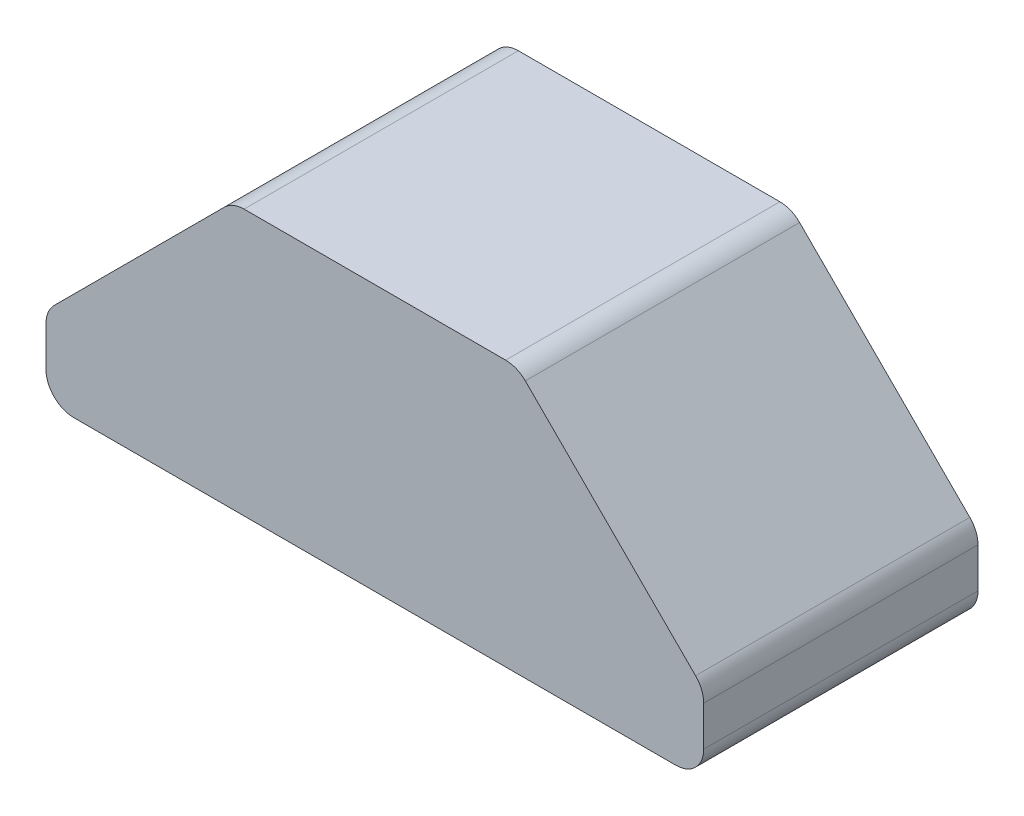
ISO-10303-21;
HEADER;
FILE_DESCRIPTION(('STEP AP214'),'2;1');
FILE_NAME('part.step','',(''),(''),'','','');
FILE_SCHEMA(('AUTOMOTIVE_DESIGN { 1 0 10303 214 1 1 1 1 }'));
ENDSEC;
DATA;
#1=APPLICATION_CONTEXT('core data for automotive mechanical design processes');
#2=APPLICATION_PROTOCOL_DEFINITION('international standard','automotive_design',2000,#1);
#3=PRODUCT_CONTEXT('',#1,'mechanical');
#4=PRODUCT('Part','Part','',(#3));
#5=PRODUCT_RELATED_PRODUCT_CATEGORY('part','',(#4));
#6=PRODUCT_DEFINITION_FORMATION('','',#4);
#7=PRODUCT_DEFINITION_CONTEXT('part definition',#1,'design');
#8=PRODUCT_DEFINITION('design','',#6,#7);
#9=PRODUCT_DEFINITION_SHAPE('','',#8);
#10=(LENGTH_UNIT() NAMED_UNIT(*) SI_UNIT(.MILLI.,.METRE.));
#11=(NAMED_UNIT(*) PLANE_ANGLE_UNIT() SI_UNIT($,.RADIAN.));
#12=(NAMED_UNIT(*) SI_UNIT($,.STERADIAN.) SOLID_ANGLE_UNIT());
#13=UNCERTAINTY_MEASURE_WITH_UNIT(LENGTH_MEASURE(1.E-05),#10,'distance_accuracy_value','');
#14=(GEOMETRIC_REPRESENTATION_CONTEXT(3) GLOBAL_UNCERTAINTY_ASSIGNED_CONTEXT((#13)) GLOBAL_UNIT_ASSIGNED_CONTEXT((#10,
#11,#12)) REPRESENTATION_CONTEXT('',''));
#15=CARTESIAN_POINT('',(0.,0.,0.));
#16=DIRECTION('',(0.,0.,1.));
#17=DIRECTION('',(1.,0.,0.));
#18=AXIS2_PLACEMENT_3D('',#15,#16,#17);
#19=CARTESIAN_POINT('',(9.03728779759871,-10.9630597708542,-5.));
#20=DIRECTION('',(0.,0.,1.));
#21=DIRECTION('',(1.,0.,0.));
#22=AXIS2_PLACEMENT_3D('',#19,#20,#21);
#23=CYLINDRICAL_SURFACE('',#22,0.508);
#24=CARTESIAN_POINT('',(9.03728779759871,-10.9630597708542,0.));
#25=DIRECTION('',(0.,0.,1.));
#26=DIRECTION('',(1.,0.,0.));
#27=AXIS2_PLACEMENT_3D('',#24,#25,#26);
#28=CIRCLE('',#27,0.508);
#29=CARTESIAN_POINT('',(8.52928779759871,-10.9630597708542,0.));
#30=VERTEX_POINT('',#29);
#31=CARTESIAN_POINT('',(9.03728779759871,-11.4710597708542,0.));
#32=VERTEX_POINT('',#31);
#33=EDGE_CURVE('E179',#30,#32,#28,.T.);
#34=ORIENTED_EDGE('',*,*,#33,.F.);
#35=DIRECTION('',(0.,0.,1.));
#36=VECTOR('',#35,1.);
#37=CARTESIAN_POINT('',(8.52928779759871,-10.9630597708542,-5.));
#38=LINE('',#37,#36);
#39=CARTESIAN_POINT('',(8.52928779759871,-10.9630597708542,-5.));
#40=VERTEX_POINT('',#39);
#41=EDGE_CURVE('E42',#40,#30,#38,.T.);
#42=ORIENTED_EDGE('',*,*,#41,.F.);
#43=CARTESIAN_POINT('',(9.03728779759871,-10.9630597708542,-5.));
#44=DIRECTION('',(0.,0.,1.));
#45=DIRECTION('',(1.,0.,0.));
#46=AXIS2_PLACEMENT_3D('',#43,#44,#45);
#47=CIRCLE('',#46,0.508);
#48=CARTESIAN_POINT('',(9.03728779759871,-11.4710597708542,-5.));
#49=VERTEX_POINT('',#48);
#50=EDGE_CURVE('E141',#40,#49,#47,.T.);
#51=ORIENTED_EDGE('',*,*,#50,.T.);
#52=DIRECTION('',(0.,0.,1.));
#53=VECTOR('',#52,1.);
#54=CARTESIAN_POINT('',(9.03728779759871,-11.4710597708542,-5.));
#55=LINE('',#54,#53);
#56=EDGE_CURVE('E11',#49,#32,#55,.T.);
#57=ORIENTED_EDGE('',*,*,#56,.T.);
#58=EDGE_LOOP('',(#34,#42,#51,#57));
#59=FACE_BOUND('',#58,.T.);
#60=ADVANCED_FACE('F32',(#59),#23,.T.);
#61=CARTESIAN_POINT('',(8.52928779759871,-10.9630597708542,-5.));
#62=DIRECTION('',(-1.,0.,0.));
#63=DIRECTION('',(0.,0.,1.));
#64=AXIS2_PLACEMENT_3D('',#61,#62,#63);
#65=PLANE('',#64);
#66=DIRECTION('',(0.,-1.,0.));
#67=VECTOR('',#66,1.);
#68=CARTESIAN_POINT('',(8.52928779759871,-10.9630597708542,0.));
#69=LINE('',#68,#67);
#70=CARTESIAN_POINT('',(8.52928779759871,-10.2371404323196,0.));
#71=VERTEX_POINT('',#70);
#72=EDGE_CURVE('E127',#71,#30,#69,.T.);
#73=ORIENTED_EDGE('',*,*,#72,.F.);
#74=DIRECTION('',(0.,0.,1.));
#75=VECTOR('',#74,1.);
#76=CARTESIAN_POINT('',(8.52928779759871,-10.2371404323196,-5.));
#77=LINE('',#76,#75);
#78=CARTESIAN_POINT('',(8.52928779759871,-10.2371404323196,-5.));
#79=VERTEX_POINT('',#78);
#80=EDGE_CURVE('E122',#79,#71,#77,.T.);
#81=ORIENTED_EDGE('',*,*,#80,.F.);
#82=DIRECTION('',(0.,-1.,0.));
#83=VECTOR('',#82,1.);
#84=CARTESIAN_POINT('',(8.52928779759871,-10.9630597708542,-5.));
#85=LINE('',#84,#83);
#86=EDGE_CURVE('E125',#79,#40,#85,.T.);
#87=ORIENTED_EDGE('',*,*,#86,.T.);
#88=ORIENTED_EDGE('',*,*,#41,.T.);
#89=EDGE_LOOP('',(#73,#81,#87,#88));
#90=FACE_BOUND('',#89,.T.);
#91=ADVANCED_FACE('F124',(#90),#65,.T.);
#92=CARTESIAN_POINT('',(9.03728779759871,-10.2371404323196,-5.));
#93=DIRECTION('',(0.,0.,1.));
#94=DIRECTION('',(1.,0.,0.));
#95=AXIS2_PLACEMENT_3D('',#92,#93,#94);
#96=CYLINDRICAL_SURFACE('',#95,0.508);
#97=CARTESIAN_POINT('',(9.03728779759871,-10.2371404323196,0.));
#98=DIRECTION('',(0.,0.,1.));
#99=DIRECTION('',(1.,0.,0.));
#100=AXIS2_PLACEMENT_3D('',#97,#98,#99);
#101=CIRCLE('',#100,0.508);
#102=CARTESIAN_POINT('',(8.67807755275595,-9.87793018747682,0.));
#103=VERTEX_POINT('',#102);
#104=EDGE_CURVE('E176',#103,#71,#101,.T.);
#105=ORIENTED_EDGE('',*,*,#104,.F.);
#106=DIRECTION('',(0.,0.,1.));
#107=VECTOR('',#106,1.);
#108=CARTESIAN_POINT('',(8.67807755275595,-9.87793018747682,-5.));
#109=LINE('',#108,#107);
#110=CARTESIAN_POINT('',(8.67807755275595,-9.87793018747682,-5.));
#111=VERTEX_POINT('',#110);
#112=EDGE_CURVE('E132',#111,#103,#109,.T.);
#113=ORIENTED_EDGE('',*,*,#112,.F.);
#114=CARTESIAN_POINT('',(9.03728779759871,-10.2371404323196,-5.));
#115=DIRECTION('',(0.,0.,1.));
#116=DIRECTION('',(1.,0.,0.));
#117=AXIS2_PLACEMENT_3D('',#114,#115,#116);
#118=CIRCLE('',#117,0.508);
#119=EDGE_CURVE('E138',#111,#79,#118,.T.);
#120=ORIENTED_EDGE('',*,*,#119,.T.);
#121=ORIENTED_EDGE('',*,*,#80,.T.);
#122=EDGE_LOOP('',(#105,#113,#120,#121));
#123=FACE_BOUND('',#122,.T.);
#124=ADVANCED_FACE('F143',(#123),#96,.T.);
#125=CARTESIAN_POINT('',(8.67807755275595,-9.87793018747682,-5.));
#126=DIRECTION('',(-0.707106781186548,0.707106781186547,0.));
#127=DIRECTION('',(-0.707106781186547,-0.707106781186548,0.));
#128=AXIS2_PLACEMENT_3D('',#125,#126,#127);
#129=PLANE('',#128);
#130=DIRECTION('',(-0.707106781186547,-0.707106781186548,0.));
#131=VECTOR('',#130,1.);
#132=CARTESIAN_POINT('',(8.67807755275595,-9.87793018747682,0.));
#133=LINE('',#132,#131);
#134=CARTESIAN_POINT('',(11.7811582142213,-6.77484952601147,0.));
#135=VERTEX_POINT('',#134);
#136=EDGE_CURVE('E173',#135,#103,#133,.T.);
#137=ORIENTED_EDGE('',*,*,#136,.F.);
#138=DIRECTION('',(0.,0.,1.));
#139=VECTOR('',#138,1.);
#140=CARTESIAN_POINT('',(11.7811582142213,-6.77484952601147,-5.));
#141=LINE('',#140,#139);
#142=CARTESIAN_POINT('',(11.7811582142213,-6.77484952601147,-5.));
#143=VERTEX_POINT('',#142);
#144=EDGE_CURVE('E184',#143,#135,#141,.T.);
#145=ORIENTED_EDGE('',*,*,#144,.F.);
#146=DIRECTION('',(-0.707106781186547,-0.707106781186548,0.));
#147=VECTOR('',#146,1.);
#148=CARTESIAN_POINT('',(8.67807755275595,-9.87793018747682,-5.));
#149=LINE('',#148,#147);
#150=EDGE_CURVE('E144',#143,#111,#149,.T.);
#151=ORIENTED_EDGE('',*,*,#150,.T.);
#152=ORIENTED_EDGE('',*,*,#112,.T.);
#153=EDGE_LOOP('',(#137,#145,#151,#152));
#154=FACE_BOUND('',#153,.T.);
#155=ADVANCED_FACE('F217',(#154),#129,.T.);
#156=CARTESIAN_POINT('',(12.1403684590641,-7.13405977085423,-5.));
#157=DIRECTION('',(0.,0.,1.));
#158=DIRECTION('',(1.,0.,0.));
#159=AXIS2_PLACEMENT_3D('',#156,#157,#158);
#160=CYLINDRICAL_SURFACE('',#159,0.507999999999999);
#161=CARTESIAN_POINT('',(12.1403684590641,-7.13405977085423,0.));
#162=DIRECTION('',(0.,0.,1.));
#163=DIRECTION('',(1.,0.,0.));
#164=AXIS2_PLACEMENT_3D('',#161,#162,#163);
#165=CIRCLE('',#164,0.507999999999999);
#166=CARTESIAN_POINT('',(12.1403684590641,-6.62605977085423,0.));
#167=VERTEX_POINT('',#166);
#168=EDGE_CURVE('E170',#167,#135,#165,.T.);
#169=ORIENTED_EDGE('',*,*,#168,.F.);
#170=DIRECTION('',(0.,0.,1.));
#171=VECTOR('',#170,1.);
#172=CARTESIAN_POINT('',(12.1403684590641,-6.62605977085423,-5.));
#173=LINE('',#172,#171);
#174=CARTESIAN_POINT('',(12.1403684590641,-6.62605977085423,-5.));
#175=VERTEX_POINT('',#174);
#176=EDGE_CURVE('E186',#175,#167,#173,.T.);
#177=ORIENTED_EDGE('',*,*,#176,.F.);
#178=CARTESIAN_POINT('',(12.1403684590641,-7.13405977085423,-5.));
#179=DIRECTION('',(0.,0.,1.));
#180=DIRECTION('',(1.,0.,0.));
#181=AXIS2_PLACEMENT_3D('',#178,#179,#180);
#182=CIRCLE('',#181,0.507999999999999);
#183=EDGE_CURVE('E146',#175,#143,#182,.T.);
#184=ORIENTED_EDGE('',*,*,#183,.T.);
#185=ORIENTED_EDGE('',*,*,#144,.T.);
#186=EDGE_LOOP('',(#169,#177,#184,#185));
#187=FACE_BOUND('',#186,.T.);
#188=ADVANCED_FACE('F220',(#187),#160,.T.);
#189=CARTESIAN_POINT('',(12.1403684590641,-6.62605977085423,-5.));
#190=DIRECTION('',(0.,1.,0.));
#191=DIRECTION('',(-1.,0.,0.));
#192=AXIS2_PLACEMENT_3D('',#189,#190,#191);
#193=PLANE('',#192);
#194=DIRECTION('',(-1.,0.,0.));
#195=VECTOR('',#194,1.);
#196=CARTESIAN_POINT('',(12.1403684590641,-6.62605977085423,0.));
#197=LINE('',#196,#195);
#198=CARTESIAN_POINT('',(16.9082071361334,-6.62605977085423,0.));
#199=VERTEX_POINT('',#198);
#200=EDGE_CURVE('E167',#199,#167,#197,.T.);
#201=ORIENTED_EDGE('',*,*,#200,.F.);
#202=DIRECTION('',(0.,0.,1.));
#203=VECTOR('',#202,1.);
#204=CARTESIAN_POINT('',(16.9082071361334,-6.62605977085423,-5.));
#205=LINE('',#204,#203);
#206=CARTESIAN_POINT('',(16.9082071361334,-6.62605977085423,-5.));
#207=VERTEX_POINT('',#206);
#208=EDGE_CURVE('E188',#207,#199,#205,.T.);
#209=ORIENTED_EDGE('',*,*,#208,.F.);
#210=DIRECTION('',(-1.,0.,0.));
#211=VECTOR('',#210,1.);
#212=CARTESIAN_POINT('',(12.1403684590641,-6.62605977085423,-5.));
#213=LINE('',#212,#211);
#214=EDGE_CURVE('E353',#207,#175,#213,.T.);
#215=ORIENTED_EDGE('',*,*,#214,.T.);
#216=ORIENTED_EDGE('',*,*,#176,.T.);
#217=EDGE_LOOP('',(#201,#209,#215,#216));
#218=FACE_BOUND('',#217,.T.);
#219=ADVANCED_FACE('F224',(#218),#193,.T.);
#220=CARTESIAN_POINT('',(16.9082071361334,-7.13405977085423,-5.));
#221=DIRECTION('',(0.,0.,1.));
#222=DIRECTION('',(1.,0.,0.));
#223=AXIS2_PLACEMENT_3D('',#220,#221,#222);
#224=CYLINDRICAL_SURFACE('',#223,0.508);
#225=CARTESIAN_POINT('',(16.9082071361334,-7.13405977085423,0.));
#226=DIRECTION('',(0.,0.,1.));
#227=DIRECTION('',(1.,0.,0.));
#228=AXIS2_PLACEMENT_3D('',#225,#226,#227);
#229=CIRCLE('',#228,0.508);
#230=CARTESIAN_POINT('',(17.2674173809761,-6.77484952601147,0.));
#231=VERTEX_POINT('',#230);
#232=EDGE_CURVE('E164',#231,#199,#229,.T.);
#233=ORIENTED_EDGE('',*,*,#232,.F.);
#234=DIRECTION('',(0.,0.,1.));
#235=VECTOR('',#234,1.);
#236=CARTESIAN_POINT('',(17.2674173809761,-6.77484952601147,-5.));
#237=LINE('',#236,#235);
#238=CARTESIAN_POINT('',(17.2674173809761,-6.77484952601147,-5.));
#239=VERTEX_POINT('',#238);
#240=EDGE_CURVE('E190',#239,#231,#237,.T.);
#241=ORIENTED_EDGE('',*,*,#240,.F.);
#242=CARTESIAN_POINT('',(16.9082071361334,-7.13405977085423,-5.));
#243=DIRECTION('',(0.,0.,1.));
#244=DIRECTION('',(1.,0.,0.));
#245=AXIS2_PLACEMENT_3D('',#242,#243,#244);
#246=CIRCLE('',#245,0.508);
#247=EDGE_CURVE('E357',#239,#207,#246,.T.);
#248=ORIENTED_EDGE('',*,*,#247,.T.);
#249=ORIENTED_EDGE('',*,*,#208,.T.);
#250=EDGE_LOOP('',(#233,#241,#248,#249));
#251=FACE_BOUND('',#250,.T.);
#252=ADVANCED_FACE('F228',(#251),#224,.T.);
#253=CARTESIAN_POINT('',(17.2674173809761,-6.77484952601147,-5.));
#254=DIRECTION('',(0.707106781186547,0.707106781186548,0.));
#255=DIRECTION('',(-0.707106781186548,0.707106781186547,0.));
#256=AXIS2_PLACEMENT_3D('',#253,#254,#255);
#257=PLANE('',#256);
#258=DIRECTION('',(-0.707106781186548,0.707106781186547,0.));
#259=VECTOR('',#258,1.);
#260=CARTESIAN_POINT('',(17.2674173809761,-6.77484952601147,0.));
#261=LINE('',#260,#259);
#262=CARTESIAN_POINT('',(20.3704980424415,-9.87793018747682,0.));
#263=VERTEX_POINT('',#262);
#264=EDGE_CURVE('E161',#263,#231,#261,.T.);
#265=ORIENTED_EDGE('',*,*,#264,.F.);
#266=DIRECTION('',(0.,0.,1.));
#267=VECTOR('',#266,1.);
#268=CARTESIAN_POINT('',(20.3704980424415,-9.87793018747682,-5.));
#269=LINE('',#268,#267);
#270=CARTESIAN_POINT('',(20.3704980424415,-9.87793018747682,-5.));
#271=VERTEX_POINT('',#270);
#272=EDGE_CURVE('E192',#271,#263,#269,.T.);
#273=ORIENTED_EDGE('',*,*,#272,.F.);
#274=DIRECTION('',(-0.707106781186548,0.707106781186547,0.));
#275=VECTOR('',#274,1.);
#276=CARTESIAN_POINT('',(17.2674173809761,-6.77484952601147,-5.));
#277=LINE('',#276,#275);
#278=EDGE_CURVE('E346',#271,#239,#277,.T.);
#279=ORIENTED_EDGE('',*,*,#278,.T.);
#280=ORIENTED_EDGE('',*,*,#240,.T.);
#281=EDGE_LOOP('',(#265,#273,#279,#280));
#282=FACE_BOUND('',#281,.T.);
#283=ADVANCED_FACE('F232',(#282),#257,.T.);
#284=CARTESIAN_POINT('',(20.0112877975987,-10.2371404323196,-5.));
#285=DIRECTION('',(0.,0.,1.));
#286=DIRECTION('',(1.,0.,0.));
#287=AXIS2_PLACEMENT_3D('',#284,#285,#286);
#288=CYLINDRICAL_SURFACE('',#287,0.507999999999999);
#289=CARTESIAN_POINT('',(20.0112877975987,-10.2371404323196,0.));
#290=DIRECTION('',(0.,0.,1.));
#291=DIRECTION('',(1.,0.,0.));
#292=AXIS2_PLACEMENT_3D('',#289,#290,#291);
#293=CIRCLE('',#292,0.507999999999999);
#294=CARTESIAN_POINT('',(20.5192877975987,-10.2371404323196,0.));
#295=VERTEX_POINT('',#294);
#296=EDGE_CURVE('E158',#295,#263,#293,.T.);
#297=ORIENTED_EDGE('',*,*,#296,.F.);
#298=DIRECTION('',(0.,0.,1.));
#299=VECTOR('',#298,1.);
#300=CARTESIAN_POINT('',(20.5192877975987,-10.2371404323196,-5.));
#301=LINE('',#300,#299);
#302=CARTESIAN_POINT('',(20.5192877975987,-10.2371404323196,-5.));
#303=VERTEX_POINT('',#302);
#304=EDGE_CURVE('E194',#303,#295,#301,.T.);
#305=ORIENTED_EDGE('',*,*,#304,.F.);
#306=CARTESIAN_POINT('',(20.0112877975987,-10.2371404323196,-5.));
#307=DIRECTION('',(0.,0.,1.));
#308=DIRECTION('',(1.,0.,0.));
#309=AXIS2_PLACEMENT_3D('',#306,#307,#308);
#310=CIRCLE('',#309,0.507999999999999);
#311=EDGE_CURVE('E342',#303,#271,#310,.T.);
#312=ORIENTED_EDGE('',*,*,#311,.T.);
#313=ORIENTED_EDGE('',*,*,#272,.T.);
#314=EDGE_LOOP('',(#297,#305,#312,#313));
#315=FACE_BOUND('',#314,.T.);
#316=ADVANCED_FACE('F236',(#315),#288,.T.);
#317=CARTESIAN_POINT('',(20.5192877975987,-10.2371404323196,-5.));
#318=DIRECTION('',(1.,0.,0.));
#319=DIRECTION('',(0.,0.,-1.));
#320=AXIS2_PLACEMENT_3D('',#317,#318,#319);
#321=PLANE('',#320);
#322=DIRECTION('',(0.,1.,0.));
#323=VECTOR('',#322,1.);
#324=CARTESIAN_POINT('',(20.5192877975987,-10.2371404323196,0.));
#325=LINE('',#324,#323);
#326=CARTESIAN_POINT('',(20.5192877975987,-10.9630597708542,0.));
#327=VERTEX_POINT('',#326);
#328=EDGE_CURVE('E155',#327,#295,#325,.T.);
#329=ORIENTED_EDGE('',*,*,#328,.F.);
#330=DIRECTION('',(0.,0.,1.));
#331=VECTOR('',#330,1.);
#332=CARTESIAN_POINT('',(20.5192877975987,-10.9630597708542,-5.));
#333=LINE('',#332,#331);
#334=CARTESIAN_POINT('',(20.5192877975987,-10.9630597708542,-5.));
#335=VERTEX_POINT('',#334);
#336=EDGE_CURVE('E195',#335,#327,#333,.T.);
#337=ORIENTED_EDGE('',*,*,#336,.F.);
#338=DIRECTION('',(0.,1.,0.));
#339=VECTOR('',#338,1.);
#340=CARTESIAN_POINT('',(20.5192877975987,-10.2371404323196,-5.));
#341=LINE('',#340,#339);
#342=EDGE_CURVE('E363',#335,#303,#341,.T.);
#343=ORIENTED_EDGE('',*,*,#342,.T.);
#344=ORIENTED_EDGE('',*,*,#304,.T.);
#345=EDGE_LOOP('',(#329,#337,#343,#344));
#346=FACE_BOUND('',#345,.T.);
#347=ADVANCED_FACE('F240',(#346),#321,.T.);
#348=CARTESIAN_POINT('',(20.0112877975987,-10.9630597708542,-5.));
#349=DIRECTION('',(0.,0.,1.));
#350=DIRECTION('',(1.,0.,0.));
#351=AXIS2_PLACEMENT_3D('',#348,#349,#350);
#352=CYLINDRICAL_SURFACE('',#351,0.507999999999998);
#353=CARTESIAN_POINT('',(20.0112877975987,-10.9630597708542,0.));
#354=DIRECTION('',(0.,0.,1.));
#355=DIRECTION('',(1.,0.,0.));
#356=AXIS2_PLACEMENT_3D('',#353,#354,#355);
#357=CIRCLE('',#356,0.507999999999998);
#358=CARTESIAN_POINT('',(20.0112877975987,-11.4710597708542,0.));
#359=VERTEX_POINT('',#358);
#360=EDGE_CURVE('E152',#359,#327,#357,.T.);
#361=ORIENTED_EDGE('',*,*,#360,.F.);
#362=DIRECTION('',(0.,0.,1.));
#363=VECTOR('',#362,1.);
#364=CARTESIAN_POINT('',(20.0112877975987,-11.4710597708542,-5.));
#365=LINE('',#364,#363);
#366=CARTESIAN_POINT('',(20.0112877975987,-11.4710597708542,-5.));
#367=VERTEX_POINT('',#366);
#368=EDGE_CURVE('E36',#367,#359,#365,.T.);
#369=ORIENTED_EDGE('',*,*,#368,.F.);
#370=CARTESIAN_POINT('',(20.0112877975987,-10.9630597708542,-5.));
#371=DIRECTION('',(0.,0.,1.));
#372=DIRECTION('',(1.,0.,0.));
#373=AXIS2_PLACEMENT_3D('',#370,#371,#372);
#374=CIRCLE('',#373,0.507999999999998);
#375=EDGE_CURVE('E365',#367,#335,#374,.T.);
#376=ORIENTED_EDGE('',*,*,#375,.T.);
#377=ORIENTED_EDGE('',*,*,#336,.T.);
#378=EDGE_LOOP('',(#361,#369,#376,#377));
#379=FACE_BOUND('',#378,.T.);
#380=ADVANCED_FACE('F201',(#379),#352,.T.);
#381=CARTESIAN_POINT('',(20.0112877975987,-11.4710597708542,-5.));
#382=DIRECTION('',(0.,-1.,0.));
#383=DIRECTION('',(0.,0.,-1.));
#384=AXIS2_PLACEMENT_3D('',#381,#382,#383);
#385=PLANE('',#384);
#386=DIRECTION('',(1.,0.,0.));
#387=VECTOR('',#386,1.);
#388=CARTESIAN_POINT('',(20.0112877975987,-11.4710597708542,0.));
#389=LINE('',#388,#387);
#390=EDGE_CURVE('E93',#32,#359,#389,.T.);
#391=ORIENTED_EDGE('',*,*,#390,.F.);
#392=ORIENTED_EDGE('',*,*,#56,.F.);
#393=DIRECTION('',(1.,0.,0.));
#394=VECTOR('',#393,1.);
#395=CARTESIAN_POINT('',(11.3862877975987,-11.4710597708542,-5.));
#396=LINE('',#395,#394);
#397=EDGE_CURVE('E96',#49,#367,#396,.T.);
#398=ORIENTED_EDGE('',*,*,#397,.T.);
#399=ORIENTED_EDGE('',*,*,#368,.T.);
#400=EDGE_LOOP('',(#391,#392,#398,#399));
#401=FACE_BOUND('',#400,.T.);
#402=ADVANCED_FACE('F34',(#401),#385,.T.);
#403=CARTESIAN_POINT('',(9.03728779759871,-10.9630597708542,-5.));
#404=DIRECTION('',(0.,0.,1.));
#405=DIRECTION('',(1.,0.,0.));
#406=AXIS2_PLACEMENT_3D('',#403,#404,#405);
#407=PLANE('',#406);
#408=ORIENTED_EDGE('',*,*,#397,.F.);
#409=ORIENTED_EDGE('',*,*,#50,.F.);
#410=ORIENTED_EDGE('',*,*,#86,.F.);
#411=ORIENTED_EDGE('',*,*,#119,.F.);
#412=ORIENTED_EDGE('',*,*,#150,.F.);
#413=ORIENTED_EDGE('',*,*,#183,.F.);
#414=ORIENTED_EDGE('',*,*,#214,.F.);
#415=ORIENTED_EDGE('',*,*,#247,.F.);
#416=ORIENTED_EDGE('',*,*,#278,.F.);
#417=ORIENTED_EDGE('',*,*,#311,.F.);
#418=ORIENTED_EDGE('',*,*,#342,.F.);
#419=ORIENTED_EDGE('',*,*,#375,.F.);
#420=EDGE_LOOP('',(#408,#409,#410,#411,#412,#413,#414,#415,#416,#417,#418,#419));
#421=FACE_BOUND('',#420,.T.);
#422=ADVANCED_FACE('F136',(#421),#407,.F.);
#423=CARTESIAN_POINT('',(9.03728779759871,-10.9630597708542,0.));
#424=DIRECTION('',(0.,0.,1.));
#425=DIRECTION('',(1.,0.,0.));
#426=AXIS2_PLACEMENT_3D('',#423,#424,#425);
#427=PLANE('',#426);
#428=ORIENTED_EDGE('',*,*,#33,.T.);
#429=ORIENTED_EDGE('',*,*,#390,.T.);
#430=ORIENTED_EDGE('',*,*,#360,.T.);
#431=ORIENTED_EDGE('',*,*,#328,.T.);
#432=ORIENTED_EDGE('',*,*,#296,.T.);
#433=ORIENTED_EDGE('',*,*,#264,.T.);
#434=ORIENTED_EDGE('',*,*,#232,.T.);
#435=ORIENTED_EDGE('',*,*,#200,.T.);
#436=ORIENTED_EDGE('',*,*,#168,.T.);
#437=ORIENTED_EDGE('',*,*,#136,.T.);
#438=ORIENTED_EDGE('',*,*,#104,.T.);
#439=ORIENTED_EDGE('',*,*,#72,.T.);
#440=EDGE_LOOP('',(#428,#429,#430,#431,#432,#433,#434,#435,#436,#437,#438,#439));
#441=FACE_BOUND('',#440,.T.);
#442=ADVANCED_FACE('F203',(#441),#427,.T.);
#443=CLOSED_SHELL('',(#60,#91,#124,#155,#188,#219,#252,#283,#316,#347,#380,#402,#422,#442));
#444=MANIFOLD_SOLID_BREP('B2',#443);
#445=ADVANCED_BREP_SHAPE_REPRESENTATION('',(#18,#444),#14);
#446=SHAPE_DEFINITION_REPRESENTATION(#9,#445);
ENDSEC;
END-ISO-10303-21;
